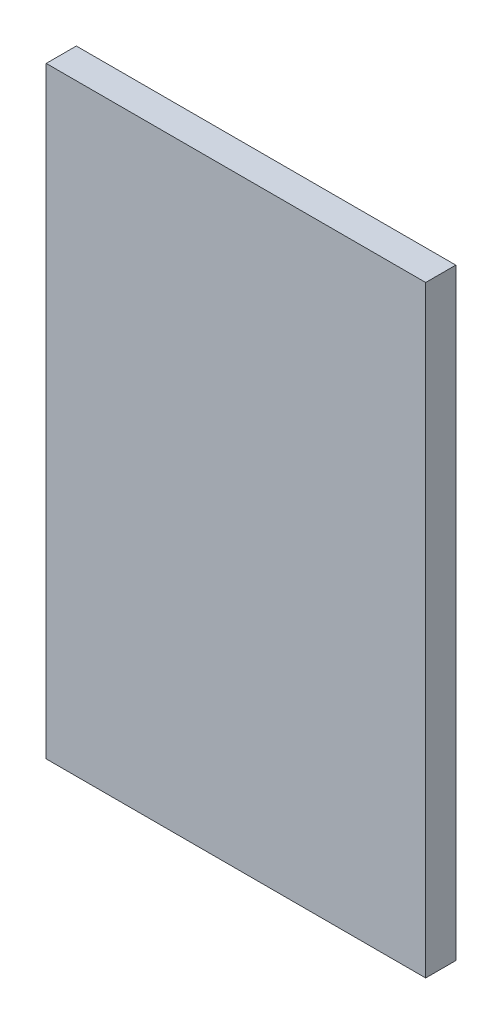
ISO-10303-21;
HEADER;
FILE_DESCRIPTION(('STEP AP214'),'2;1');
FILE_NAME('part.step','',(''),(''),'','','');
FILE_SCHEMA(('AUTOMOTIVE_DESIGN { 1 0 10303 214 1 1 1 1 }'));
ENDSEC;
DATA;
#1=APPLICATION_CONTEXT('core data for automotive mechanical design processes');
#2=APPLICATION_PROTOCOL_DEFINITION('international standard','automotive_design',2000,#1);
#3=PRODUCT_CONTEXT('',#1,'mechanical');
#4=PRODUCT('Part','Part','',(#3));
#5=PRODUCT_RELATED_PRODUCT_CATEGORY('part','',(#4));
#6=PRODUCT_DEFINITION_FORMATION('','',#4);
#7=PRODUCT_DEFINITION_CONTEXT('part definition',#1,'design');
#8=PRODUCT_DEFINITION('design','',#6,#7);
#9=PRODUCT_DEFINITION_SHAPE('','',#8);
#10=(LENGTH_UNIT() NAMED_UNIT(*) SI_UNIT(.MILLI.,.METRE.));
#11=(NAMED_UNIT(*) PLANE_ANGLE_UNIT() SI_UNIT($,.RADIAN.));
#12=(NAMED_UNIT(*) SI_UNIT($,.STERADIAN.) SOLID_ANGLE_UNIT());
#13=UNCERTAINTY_MEASURE_WITH_UNIT(LENGTH_MEASURE(1.E-05),#10,'distance_accuracy_value','');
#14=(GEOMETRIC_REPRESENTATION_CONTEXT(3) GLOBAL_UNCERTAINTY_ASSIGNED_CONTEXT((#13)) GLOBAL_UNIT_ASSIGNED_CONTEXT((#10,
#11,#12)) REPRESENTATION_CONTEXT('',''));
#15=CARTESIAN_POINT('',(0.,0.,0.));
#16=DIRECTION('',(0.,0.,1.));
#17=DIRECTION('',(1.,0.,0.));
#18=AXIS2_PLACEMENT_3D('',#15,#16,#17);
#19=CARTESIAN_POINT('',(-126.,-200.,20.));
#20=DIRECTION('',(1.,0.,0.));
#21=DIRECTION('',(0.,0.,-1.));
#22=AXIS2_PLACEMENT_3D('',#19,#20,#21);
#23=PLANE('',#22);
#24=DIRECTION('',(0.,-1.,0.));
#25=VECTOR('',#24,1.);
#26=CARTESIAN_POINT('',(-126.,-200.,0.));
#27=LINE('',#26,#25);
#28=CARTESIAN_POINT('',(-126.,200.,0.));
#29=VERTEX_POINT('',#28);
#30=CARTESIAN_POINT('',(-126.,-200.,0.));
#31=VERTEX_POINT('',#30);
#32=EDGE_CURVE('E96',#29,#31,#27,.T.);
#33=ORIENTED_EDGE('',*,*,#32,.T.);
#34=DIRECTION('',(0.,0.,-1.));
#35=VECTOR('',#34,1.);
#36=CARTESIAN_POINT('',(-126.,-200.,20.));
#37=LINE('',#36,#35);
#38=CARTESIAN_POINT('',(-126.,-200.,20.));
#39=VERTEX_POINT('',#38);
#40=EDGE_CURVE('E11',#39,#31,#37,.T.);
#41=ORIENTED_EDGE('',*,*,#40,.F.);
#42=DIRECTION('',(0.,-1.,0.));
#43=VECTOR('',#42,1.);
#44=CARTESIAN_POINT('',(-126.,-200.,20.));
#45=LINE('',#44,#43);
#46=CARTESIAN_POINT('',(-126.,200.,20.));
#47=VERTEX_POINT('',#46);
#48=EDGE_CURVE('E84',#47,#39,#45,.T.);
#49=ORIENTED_EDGE('',*,*,#48,.F.);
#50=DIRECTION('',(0.,0.,-1.));
#51=VECTOR('',#50,1.);
#52=CARTESIAN_POINT('',(-126.,200.,20.));
#53=LINE('',#52,#51);
#54=EDGE_CURVE('E92',#47,#29,#53,.T.);
#55=ORIENTED_EDGE('',*,*,#54,.T.);
#56=EDGE_LOOP('',(#33,#41,#49,#55));
#57=FACE_BOUND('',#56,.T.);
#58=ADVANCED_FACE('F33',(#57),#23,.F.);
#59=CARTESIAN_POINT('',(126.,-200.,20.));
#60=DIRECTION('',(0.,1.,0.));
#61=DIRECTION('',(-1.,0.,0.));
#62=AXIS2_PLACEMENT_3D('',#59,#60,#61);
#63=PLANE('',#62);
#64=DIRECTION('',(1.,0.,0.));
#65=VECTOR('',#64,1.);
#66=CARTESIAN_POINT('',(126.,-200.,0.));
#67=LINE('',#66,#65);
#68=CARTESIAN_POINT('',(126.,-200.,0.));
#69=VERTEX_POINT('',#68);
#70=EDGE_CURVE('E88',#31,#69,#67,.T.);
#71=ORIENTED_EDGE('',*,*,#70,.T.);
#72=DIRECTION('',(0.,0.,-1.));
#73=VECTOR('',#72,1.);
#74=CARTESIAN_POINT('',(126.,-200.,20.));
#75=LINE('',#74,#73);
#76=CARTESIAN_POINT('',(126.,-200.,20.));
#77=VERTEX_POINT('',#76);
#78=EDGE_CURVE('E41',#77,#69,#75,.T.);
#79=ORIENTED_EDGE('',*,*,#78,.F.);
#80=DIRECTION('',(1.,0.,0.));
#81=VECTOR('',#80,1.);
#82=CARTESIAN_POINT('',(126.,-200.,20.));
#83=LINE('',#82,#81);
#84=EDGE_CURVE('E79',#39,#77,#83,.T.);
#85=ORIENTED_EDGE('',*,*,#84,.F.);
#86=ORIENTED_EDGE('',*,*,#40,.T.);
#87=EDGE_LOOP('',(#71,#79,#85,#86));
#88=FACE_BOUND('',#87,.T.);
#89=ADVANCED_FACE('F87',(#88),#63,.F.);
#90=CARTESIAN_POINT('',(126.,-200.,20.));
#91=DIRECTION('',(-1.,0.,0.));
#92=DIRECTION('',(0.,0.,1.));
#93=AXIS2_PLACEMENT_3D('',#90,#91,#92);
#94=PLANE('',#93);
#95=DIRECTION('',(0.,1.,0.));
#96=VECTOR('',#95,1.);
#97=CARTESIAN_POINT('',(126.,-200.,0.));
#98=LINE('',#97,#96);
#99=CARTESIAN_POINT('',(126.,200.,0.));
#100=VERTEX_POINT('',#99);
#101=EDGE_CURVE('E66',#69,#100,#98,.T.);
#102=ORIENTED_EDGE('',*,*,#101,.T.);
#103=DIRECTION('',(0.,0.,-1.));
#104=VECTOR('',#103,1.);
#105=CARTESIAN_POINT('',(126.,200.,20.));
#106=LINE('',#105,#104);
#107=CARTESIAN_POINT('',(126.,200.,20.));
#108=VERTEX_POINT('',#107);
#109=EDGE_CURVE('E89',#108,#100,#106,.T.);
#110=ORIENTED_EDGE('',*,*,#109,.F.);
#111=DIRECTION('',(0.,1.,0.));
#112=VECTOR('',#111,1.);
#113=CARTESIAN_POINT('',(126.,-200.,20.));
#114=LINE('',#113,#112);
#115=EDGE_CURVE('E82',#77,#108,#114,.T.);
#116=ORIENTED_EDGE('',*,*,#115,.F.);
#117=ORIENTED_EDGE('',*,*,#78,.T.);
#118=EDGE_LOOP('',(#102,#110,#116,#117));
#119=FACE_BOUND('',#118,.T.);
#120=ADVANCED_FACE('F90',(#119),#94,.F.);
#121=CARTESIAN_POINT('',(126.,200.,20.));
#122=DIRECTION('',(0.,-1.,0.));
#123=DIRECTION('',(0.,0.,-1.));
#124=AXIS2_PLACEMENT_3D('',#121,#122,#123);
#125=PLANE('',#124);
#126=DIRECTION('',(-1.,0.,0.));
#127=VECTOR('',#126,1.);
#128=CARTESIAN_POINT('',(126.,200.,0.));
#129=LINE('',#128,#127);
#130=EDGE_CURVE('E72',#100,#29,#129,.T.);
#131=ORIENTED_EDGE('',*,*,#130,.T.);
#132=ORIENTED_EDGE('',*,*,#54,.F.);
#133=DIRECTION('',(-1.,0.,0.));
#134=VECTOR('',#133,1.);
#135=CARTESIAN_POINT('',(126.,200.,20.));
#136=LINE('',#135,#134);
#137=EDGE_CURVE('E49',#108,#47,#136,.T.);
#138=ORIENTED_EDGE('',*,*,#137,.F.);
#139=ORIENTED_EDGE('',*,*,#109,.T.);
#140=EDGE_LOOP('',(#131,#132,#138,#139));
#141=FACE_BOUND('',#140,.T.);
#142=ADVANCED_FACE('F103',(#141),#125,.F.);
#143=CARTESIAN_POINT('',(0.,0.,20.));
#144=DIRECTION('',(0.,0.,1.));
#145=DIRECTION('',(1.,0.,0.));
#146=AXIS2_PLACEMENT_3D('',#143,#144,#145);
#147=PLANE('',#146);
#148=ORIENTED_EDGE('',*,*,#48,.T.);
#149=ORIENTED_EDGE('',*,*,#84,.T.);
#150=ORIENTED_EDGE('',*,*,#115,.T.);
#151=ORIENTED_EDGE('',*,*,#137,.T.);
#152=EDGE_LOOP('',(#148,#149,#150,#151));
#153=FACE_BOUND('',#152,.T.);
#154=ADVANCED_FACE('F80',(#153),#147,.T.);
#155=CARTESIAN_POINT('',(0.,0.,0.));
#156=DIRECTION('',(0.,0.,1.));
#157=DIRECTION('',(1.,0.,0.));
#158=AXIS2_PLACEMENT_3D('',#155,#156,#157);
#159=PLANE('',#158);
#160=ORIENTED_EDGE('',*,*,#32,.F.);
#161=ORIENTED_EDGE('',*,*,#130,.F.);
#162=ORIENTED_EDGE('',*,*,#101,.F.);
#163=ORIENTED_EDGE('',*,*,#70,.F.);
#164=EDGE_LOOP('',(#160,#161,#162,#163));
#165=FACE_BOUND('',#164,.T.);
#166=ADVANCED_FACE('F106',(#165),#159,.F.);
#167=CLOSED_SHELL('',(#58,#89,#120,#142,#154,#166));
#168=MANIFOLD_SOLID_BREP('B2',#167);
#169=ADVANCED_BREP_SHAPE_REPRESENTATION('',(#18,#168),#14);
#170=SHAPE_DEFINITION_REPRESENTATION(#9,#169);
ENDSEC;
END-ISO-10303-21;
